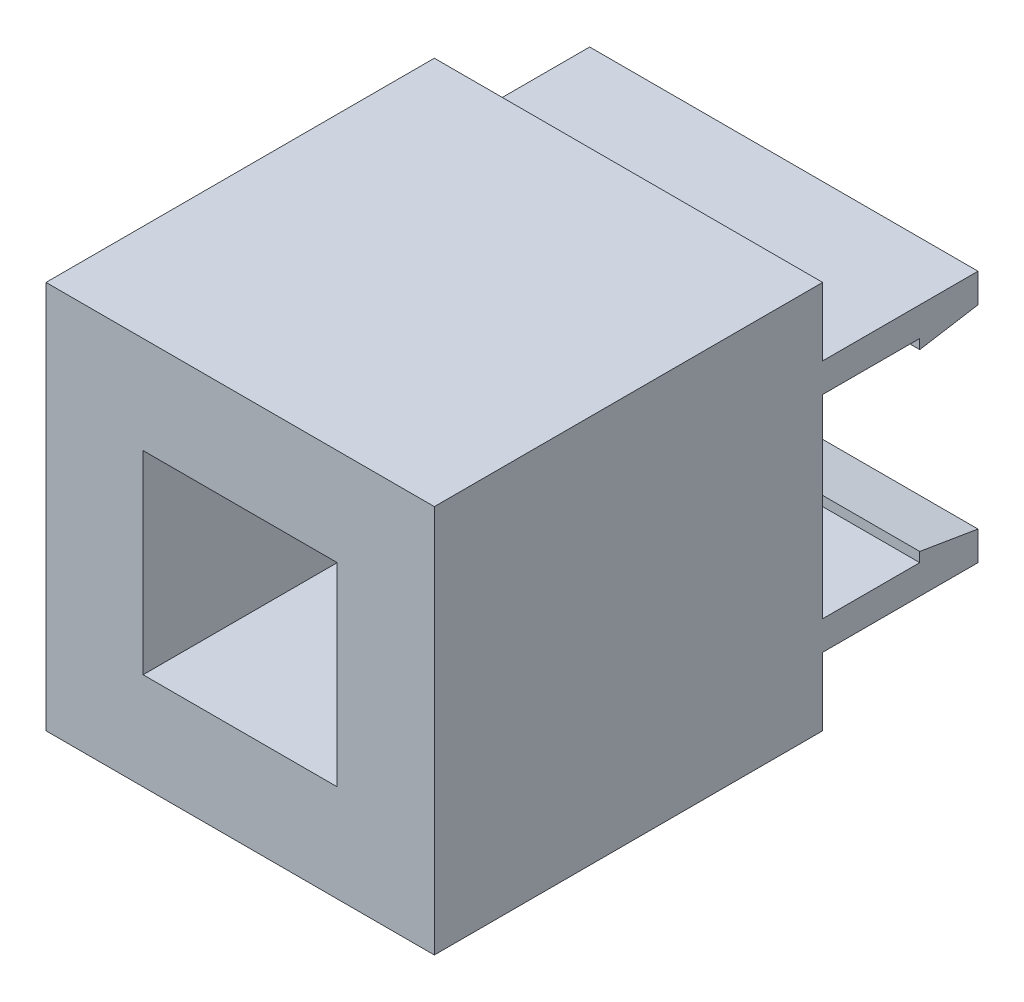
ISO-10303-21;
HEADER;
FILE_DESCRIPTION(('STEP AP214'),'2;1');
FILE_NAME('part.step','',(''),(''),'','','');
FILE_SCHEMA(('AUTOMOTIVE_DESIGN { 1 0 10303 214 1 1 1 1 }'));
ENDSEC;
DATA;
#1=APPLICATION_CONTEXT('core data for automotive mechanical design processes');
#2=APPLICATION_PROTOCOL_DEFINITION('international standard','automotive_design',2000,#1);
#3=PRODUCT_CONTEXT('',#1,'mechanical');
#4=PRODUCT('Part','Part','',(#3));
#5=PRODUCT_RELATED_PRODUCT_CATEGORY('part','',(#4));
#6=PRODUCT_DEFINITION_FORMATION('','',#4);
#7=PRODUCT_DEFINITION_CONTEXT('part definition',#1,'design');
#8=PRODUCT_DEFINITION('design','',#6,#7);
#9=PRODUCT_DEFINITION_SHAPE('','',#8);
#10=(LENGTH_UNIT() NAMED_UNIT(*) SI_UNIT(.MILLI.,.METRE.));
#11=(NAMED_UNIT(*) PLANE_ANGLE_UNIT() SI_UNIT($,.RADIAN.));
#12=(NAMED_UNIT(*) SI_UNIT($,.STERADIAN.) SOLID_ANGLE_UNIT());
#13=UNCERTAINTY_MEASURE_WITH_UNIT(LENGTH_MEASURE(1.E-05),#10,'distance_accuracy_value','');
#14=(GEOMETRIC_REPRESENTATION_CONTEXT(3) GLOBAL_UNCERTAINTY_ASSIGNED_CONTEXT((#13)) GLOBAL_UNIT_ASSIGNED_CONTEXT((#10,
#11,#12)) REPRESENTATION_CONTEXT('',''));
#15=CARTESIAN_POINT('',(0.,0.,0.));
#16=DIRECTION('',(0.,0.,1.));
#17=DIRECTION('',(1.,0.,0.));
#18=AXIS2_PLACEMENT_3D('',#15,#16,#17);
#19=CARTESIAN_POINT('',(0.,0.,0.));
#20=DIRECTION('',(0.,0.,-1.));
#21=DIRECTION('',(-1.,0.,0.));
#22=AXIS2_PLACEMENT_3D('',#19,#20,#21);
#23=PLANE('',#22);
#24=DIRECTION('',(0.,1.,0.));
#25=VECTOR('',#24,1.);
#26=CARTESIAN_POINT('',(15.,-5.,0.));
#27=LINE('',#26,#25);
#28=CARTESIAN_POINT('',(15.,0.,0.));
#29=VERTEX_POINT('',#28);
#30=CARTESIAN_POINT('',(15.,10.,0.));
#31=VERTEX_POINT('',#30);
#32=EDGE_CURVE('E189',#29,#31,#27,.T.);
#33=ORIENTED_EDGE('',*,*,#32,.F.);
#34=DIRECTION('',(1.,0.,0.));
#35=VECTOR('',#34,1.);
#36=CARTESIAN_POINT('',(-5.,0.,0.));
#37=LINE('',#36,#35);
#38=CARTESIAN_POINT('',(10.,0.,0.));
#39=VERTEX_POINT('',#38);
#40=EDGE_CURVE('E250',#39,#29,#37,.T.);
#41=ORIENTED_EDGE('',*,*,#40,.F.);
#42=DIRECTION('',(0.,1.,0.));
#43=VECTOR('',#42,1.);
#44=CARTESIAN_POINT('',(10.,0.,0.));
#45=LINE('',#44,#43);
#46=CARTESIAN_POINT('',(10.,10.,0.));
#47=VERTEX_POINT('',#46);
#48=EDGE_CURVE('E279',#39,#47,#45,.T.);
#49=ORIENTED_EDGE('',*,*,#48,.T.);
#50=DIRECTION('',(-1.,0.,0.));
#51=VECTOR('',#50,1.);
#52=CARTESIAN_POINT('',(-5.,10.,0.));
#53=LINE('',#52,#51);
#54=EDGE_CURVE('E44',#31,#47,#53,.T.);
#55=ORIENTED_EDGE('',*,*,#54,.F.);
#56=EDGE_LOOP('',(#33,#41,#49,#55));
#57=FACE_BOUND('',#56,.T.);
#58=ADVANCED_FACE('F34',(#57),#23,.T.);
#59=DIRECTION('',(0.,-1.,0.));
#60=VECTOR('',#59,1.);
#61=CARTESIAN_POINT('',(0.,0.,0.));
#62=LINE('',#61,#60);
#63=CARTESIAN_POINT('',(0.,10.,0.));
#64=VERTEX_POINT('',#63);
#65=CARTESIAN_POINT('',(0.,0.,0.));
#66=VERTEX_POINT('',#65);
#67=EDGE_CURVE('E275',#64,#66,#62,.T.);
#68=ORIENTED_EDGE('',*,*,#67,.T.);
#69=CARTESIAN_POINT('',(-5.,0.,0.));
#70=VERTEX_POINT('',#69);
#71=EDGE_CURVE('E257',#70,#66,#37,.T.);
#72=ORIENTED_EDGE('',*,*,#71,.F.);
#73=DIRECTION('',(0.,-1.,0.));
#74=VECTOR('',#73,1.);
#75=CARTESIAN_POINT('',(-5.,-5.,0.));
#76=LINE('',#75,#74);
#77=CARTESIAN_POINT('',(-5.,10.,0.));
#78=VERTEX_POINT('',#77);
#79=EDGE_CURVE('E313',#78,#70,#76,.T.);
#80=ORIENTED_EDGE('',*,*,#79,.F.);
#81=EDGE_CURVE('E11',#64,#78,#53,.T.);
#82=ORIENTED_EDGE('',*,*,#81,.F.);
#83=EDGE_LOOP('',(#68,#72,#80,#82));
#84=FACE_BOUND('',#83,.T.);
#85=ADVANCED_FACE('F391',(#84),#23,.T.);
#86=CARTESIAN_POINT('',(-5.,-1.5,0.));
#87=VERTEX_POINT('',#86);
#88=CARTESIAN_POINT('',(-5.,-5.,0.));
#89=VERTEX_POINT('',#88);
#90=EDGE_CURVE('E194',#87,#89,#76,.T.);
#91=ORIENTED_EDGE('',*,*,#90,.F.);
#92=DIRECTION('',(-1.,0.,0.));
#93=VECTOR('',#92,1.);
#94=CARTESIAN_POINT('',(15.,-1.5,0.));
#95=LINE('',#94,#93);
#96=CARTESIAN_POINT('',(15.,-1.5,0.));
#97=VERTEX_POINT('',#96);
#98=EDGE_CURVE('E192',#97,#87,#95,.T.);
#99=ORIENTED_EDGE('',*,*,#98,.F.);
#100=CARTESIAN_POINT('',(15.,-5.,0.));
#101=VERTEX_POINT('',#100);
#102=EDGE_CURVE('E176',#101,#97,#27,.T.);
#103=ORIENTED_EDGE('',*,*,#102,.F.);
#104=DIRECTION('',(1.,0.,0.));
#105=VECTOR('',#104,1.);
#106=CARTESIAN_POINT('',(-5.,-5.,0.));
#107=LINE('',#106,#105);
#108=EDGE_CURVE('E312',#89,#101,#107,.T.);
#109=ORIENTED_EDGE('',*,*,#108,.F.);
#110=EDGE_LOOP('',(#91,#99,#103,#109));
#111=FACE_BOUND('',#110,.T.);
#112=ADVANCED_FACE('F193',(#111),#23,.T.);
#113=CARTESIAN_POINT('',(0.,0.,20.));
#114=DIRECTION('',(0.,0.,-1.));
#115=DIRECTION('',(-1.,0.,0.));
#116=AXIS2_PLACEMENT_3D('',#113,#114,#115);
#117=PLANE('',#116);
#118=DIRECTION('',(0.,-1.,0.));
#119=VECTOR('',#118,1.);
#120=CARTESIAN_POINT('',(-5.,-5.,20.));
#121=LINE('',#120,#119);
#122=CARTESIAN_POINT('',(-5.,15.,20.));
#123=VERTEX_POINT('',#122);
#124=CARTESIAN_POINT('',(-5.,-5.,20.));
#125=VERTEX_POINT('',#124);
#126=EDGE_CURVE('E300',#123,#125,#121,.T.);
#127=ORIENTED_EDGE('',*,*,#126,.T.);
#128=DIRECTION('',(1.,0.,0.));
#129=VECTOR('',#128,1.);
#130=CARTESIAN_POINT('',(-5.,-5.,20.));
#131=LINE('',#130,#129);
#132=CARTESIAN_POINT('',(15.,-5.,20.));
#133=VERTEX_POINT('',#132);
#134=EDGE_CURVE('E303',#125,#133,#131,.T.);
#135=ORIENTED_EDGE('',*,*,#134,.T.);
#136=DIRECTION('',(0.,1.,0.));
#137=VECTOR('',#136,1.);
#138=CARTESIAN_POINT('',(15.,-5.,20.));
#139=LINE('',#138,#137);
#140=CARTESIAN_POINT('',(15.,15.,20.));
#141=VERTEX_POINT('',#140);
#142=EDGE_CURVE('E305',#133,#141,#139,.T.);
#143=ORIENTED_EDGE('',*,*,#142,.T.);
#144=DIRECTION('',(-1.,0.,0.));
#145=VECTOR('',#144,1.);
#146=CARTESIAN_POINT('',(-5.,15.,20.));
#147=LINE('',#146,#145);
#148=EDGE_CURVE('E307',#141,#123,#147,.T.);
#149=ORIENTED_EDGE('',*,*,#148,.T.);
#150=EDGE_LOOP('',(#127,#135,#143,#149));
#151=FACE_BOUND('',#150,.T.);
#152=DIRECTION('',(0.,-1.,0.));
#153=VECTOR('',#152,1.);
#154=CARTESIAN_POINT('',(0.,0.,20.));
#155=LINE('',#154,#153);
#156=CARTESIAN_POINT('',(0.,10.,20.));
#157=VERTEX_POINT('',#156);
#158=CARTESIAN_POINT('',(0.,0.,20.));
#159=VERTEX_POINT('',#158);
#160=EDGE_CURVE('E276',#157,#159,#155,.T.);
#161=ORIENTED_EDGE('',*,*,#160,.F.);
#162=DIRECTION('',(-1.,0.,0.));
#163=VECTOR('',#162,1.);
#164=CARTESIAN_POINT('',(0.,10.,20.));
#165=LINE('',#164,#163);
#166=CARTESIAN_POINT('',(10.,10.,20.));
#167=VERTEX_POINT('',#166);
#168=EDGE_CURVE('E284',#167,#157,#165,.T.);
#169=ORIENTED_EDGE('',*,*,#168,.F.);
#170=DIRECTION('',(0.,1.,0.));
#171=VECTOR('',#170,1.);
#172=CARTESIAN_POINT('',(10.,0.,20.));
#173=LINE('',#172,#171);
#174=CARTESIAN_POINT('',(10.,0.,20.));
#175=VERTEX_POINT('',#174);
#176=EDGE_CURVE('E281',#175,#167,#173,.T.);
#177=ORIENTED_EDGE('',*,*,#176,.F.);
#178=DIRECTION('',(1.,0.,0.));
#179=VECTOR('',#178,1.);
#180=CARTESIAN_POINT('',(0.,0.,20.));
#181=LINE('',#180,#179);
#182=EDGE_CURVE('E278',#159,#175,#181,.T.);
#183=ORIENTED_EDGE('',*,*,#182,.F.);
#184=EDGE_LOOP('',(#161,#169,#177,#183));
#185=FACE_BOUND('',#184,.T.);
#186=ADVANCED_FACE('F376',(#151,#185),#117,.F.);
#187=CARTESIAN_POINT('',(15.,11.5,0.));
#188=VERTEX_POINT('',#187);
#189=CARTESIAN_POINT('',(15.,15.,0.));
#190=VERTEX_POINT('',#189);
#191=EDGE_CURVE('E191',#188,#190,#27,.T.);
#192=ORIENTED_EDGE('',*,*,#191,.F.);
#193=DIRECTION('',(-1.,0.,0.));
#194=VECTOR('',#193,1.);
#195=CARTESIAN_POINT('',(15.,11.5,0.));
#196=LINE('',#195,#194);
#197=CARTESIAN_POINT('',(-5.,11.5,0.));
#198=VERTEX_POINT('',#197);
#199=EDGE_CURVE('E207',#188,#198,#196,.T.);
#200=ORIENTED_EDGE('',*,*,#199,.T.);
#201=CARTESIAN_POINT('',(-5.,15.,0.));
#202=VERTEX_POINT('',#201);
#203=EDGE_CURVE('E310',#202,#198,#76,.T.);
#204=ORIENTED_EDGE('',*,*,#203,.F.);
#205=DIRECTION('',(-1.,0.,0.));
#206=VECTOR('',#205,1.);
#207=CARTESIAN_POINT('',(-5.,15.,0.));
#208=LINE('',#207,#206);
#209=EDGE_CURVE('E188',#190,#202,#208,.T.);
#210=ORIENTED_EDGE('',*,*,#209,.F.);
#211=EDGE_LOOP('',(#192,#200,#204,#210));
#212=FACE_BOUND('',#211,.T.);
#213=ADVANCED_FACE('F370',(#212),#23,.T.);
#214=CARTESIAN_POINT('',(-5.,-5.,20.));
#215=DIRECTION('',(1.,0.,0.));
#216=DIRECTION('',(0.,0.,-1.));
#217=AXIS2_PLACEMENT_3D('',#214,#215,#216);
#218=PLANE('',#217);
#219=DIRECTION('',(0.,-1.,0.));
#220=VECTOR('',#219,1.);
#221=CARTESIAN_POINT('',(-5.,-3.,-8.));
#222=LINE('',#221,#220);
#223=CARTESIAN_POINT('',(-5.,0.,-8.));
#224=VERTEX_POINT('',#223);
#225=CARTESIAN_POINT('',(-5.,-1.5,-8.));
#226=VERTEX_POINT('',#225);
#227=EDGE_CURVE('E215',#224,#226,#222,.T.);
#228=ORIENTED_EDGE('',*,*,#227,.T.);
#229=DIRECTION('',(0.,0.,-1.));
#230=VECTOR('',#229,1.);
#231=CARTESIAN_POINT('',(-5.,-1.5,-8.));
#232=LINE('',#231,#230);
#233=EDGE_CURVE('E51',#87,#226,#232,.T.);
#234=ORIENTED_EDGE('',*,*,#233,.F.);
#235=ORIENTED_EDGE('',*,*,#90,.T.);
#236=DIRECTION('',(0.,0.,-1.));
#237=VECTOR('',#236,1.);
#238=CARTESIAN_POINT('',(-5.,-5.,20.));
#239=LINE('',#238,#237);
#240=EDGE_CURVE('E38',#125,#89,#239,.T.);
#241=ORIENTED_EDGE('',*,*,#240,.F.);
#242=ORIENTED_EDGE('',*,*,#126,.F.);
#243=DIRECTION('',(0.,0.,-1.));
#244=VECTOR('',#243,1.);
#245=CARTESIAN_POINT('',(-5.,15.,20.));
#246=LINE('',#245,#244);
#247=EDGE_CURVE('E309',#123,#202,#246,.T.);
#248=ORIENTED_EDGE('',*,*,#247,.T.);
#249=ORIENTED_EDGE('',*,*,#203,.T.);
#250=DIRECTION('',(0.,0.,1.));
#251=VECTOR('',#250,1.);
#252=CARTESIAN_POINT('',(-5.,11.5,-8.));
#253=LINE('',#252,#251);
#254=CARTESIAN_POINT('',(-5.,11.5,-8.));
#255=VERTEX_POINT('',#254);
#256=EDGE_CURVE('E201',#255,#198,#253,.T.);
#257=ORIENTED_EDGE('',*,*,#256,.F.);
#258=DIRECTION('',(0.,-1.,0.));
#259=VECTOR('',#258,1.);
#260=CARTESIAN_POINT('',(-5.,13.,-8.));
#261=LINE('',#260,#259);
#262=CARTESIAN_POINT('',(-5.,10.,-8.));
#263=VERTEX_POINT('',#262);
#264=EDGE_CURVE('E229',#255,#263,#261,.T.);
#265=ORIENTED_EDGE('',*,*,#264,.T.);
#266=DIRECTION('',(0.,-0.164398987305357,0.986393923832144));
#267=VECTOR('',#266,1.);
#268=CARTESIAN_POINT('',(-5.,10.,-8.));
#269=LINE('',#268,#267);
#270=CARTESIAN_POINT('',(-5.,9.5,-5.));
#271=VERTEX_POINT('',#270);
#272=EDGE_CURVE('E243',#263,#271,#269,.T.);
#273=ORIENTED_EDGE('',*,*,#272,.T.);
#274=DIRECTION('',(0.,1.,0.));
#275=VECTOR('',#274,1.);
#276=CARTESIAN_POINT('',(-5.,10.,-5.));
#277=LINE('',#276,#275);
#278=CARTESIAN_POINT('',(-5.,10.,-5.));
#279=VERTEX_POINT('',#278);
#280=EDGE_CURVE('E236',#271,#279,#277,.T.);
#281=ORIENTED_EDGE('',*,*,#280,.T.);
#282=DIRECTION('',(0.,0.,1.));
#283=VECTOR('',#282,1.);
#284=CARTESIAN_POINT('',(-5.,10.,-5.));
#285=LINE('',#284,#283);
#286=EDGE_CURVE('E267',#279,#78,#285,.T.);
#287=ORIENTED_EDGE('',*,*,#286,.T.);
#288=ORIENTED_EDGE('',*,*,#79,.T.);
#289=DIRECTION('',(0.,0.,1.));
#290=VECTOR('',#289,1.);
#291=CARTESIAN_POINT('',(-5.,0.,-5.));
#292=LINE('',#291,#290);
#293=CARTESIAN_POINT('',(-5.,0.,-5.));
#294=VERTEX_POINT('',#293);
#295=EDGE_CURVE('E262',#294,#70,#292,.T.);
#296=ORIENTED_EDGE('',*,*,#295,.F.);
#297=DIRECTION('',(0.,1.,0.));
#298=VECTOR('',#297,1.);
#299=CARTESIAN_POINT('',(-5.,0.,-5.));
#300=LINE('',#299,#298);
#301=CARTESIAN_POINT('',(-5.,0.5,-5.));
#302=VERTEX_POINT('',#301);
#303=EDGE_CURVE('E210',#294,#302,#300,.T.);
#304=ORIENTED_EDGE('',*,*,#303,.T.);
#305=DIRECTION('',(0.,-0.164398987305357,-0.986393923832144));
#306=VECTOR('',#305,1.);
#307=CARTESIAN_POINT('',(-5.,0.,-8.));
#308=LINE('',#307,#306);
#309=EDGE_CURVE('E222',#302,#224,#308,.T.);
#310=ORIENTED_EDGE('',*,*,#309,.T.);
#311=EDGE_LOOP('',(#228,#234,#235,#241,#242,#248,#249,#257,#265,#273,#281,#287,#288,#296,#304,#310));
#312=FACE_BOUND('',#311,.T.);
#313=ADVANCED_FACE('F36',(#312),#218,.F.);
#314=CARTESIAN_POINT('',(-5.,-5.,20.));
#315=DIRECTION('',(0.,1.,0.));
#316=DIRECTION('',(0.,0.,1.));
#317=AXIS2_PLACEMENT_3D('',#314,#315,#316);
#318=PLANE('',#317);
#319=ORIENTED_EDGE('',*,*,#108,.T.);
#320=DIRECTION('',(0.,0.,-1.));
#321=VECTOR('',#320,1.);
#322=CARTESIAN_POINT('',(15.,-5.,20.));
#323=LINE('',#322,#321);
#324=EDGE_CURVE('E185',#133,#101,#323,.T.);
#325=ORIENTED_EDGE('',*,*,#324,.F.);
#326=ORIENTED_EDGE('',*,*,#134,.F.);
#327=ORIENTED_EDGE('',*,*,#240,.T.);
#328=EDGE_LOOP('',(#319,#325,#326,#327));
#329=FACE_BOUND('',#328,.T.);
#330=ADVANCED_FACE('F323',(#329),#318,.F.);
#331=CARTESIAN_POINT('',(15.,-5.,20.));
#332=DIRECTION('',(-1.,0.,0.));
#333=DIRECTION('',(0.,0.,1.));
#334=AXIS2_PLACEMENT_3D('',#331,#332,#333);
#335=PLANE('',#334);
#336=ORIENTED_EDGE('',*,*,#102,.T.);
#337=DIRECTION('',(0.,0.,-1.));
#338=VECTOR('',#337,1.);
#339=CARTESIAN_POINT('',(15.,-1.5,-8.));
#340=LINE('',#339,#338);
#341=CARTESIAN_POINT('',(15.,-1.5,-8.));
#342=VERTEX_POINT('',#341);
#343=EDGE_CURVE('E181',#97,#342,#340,.T.);
#344=ORIENTED_EDGE('',*,*,#343,.T.);
#345=DIRECTION('',(0.,-1.,0.));
#346=VECTOR('',#345,1.);
#347=CARTESIAN_POINT('',(15.,-3.,-8.));
#348=LINE('',#347,#346);
#349=CARTESIAN_POINT('',(15.,0.,-8.));
#350=VERTEX_POINT('',#349);
#351=EDGE_CURVE('E218',#350,#342,#348,.T.);
#352=ORIENTED_EDGE('',*,*,#351,.F.);
#353=DIRECTION('',(0.,-0.164398987305357,-0.986393923832144));
#354=VECTOR('',#353,1.);
#355=CARTESIAN_POINT('',(15.,0.,-8.));
#356=LINE('',#355,#354);
#357=CARTESIAN_POINT('',(15.,0.5,-5.));
#358=VERTEX_POINT('',#357);
#359=EDGE_CURVE('E214',#358,#350,#356,.T.);
#360=ORIENTED_EDGE('',*,*,#359,.F.);
#361=DIRECTION('',(0.,1.,0.));
#362=VECTOR('',#361,1.);
#363=CARTESIAN_POINT('',(15.,-3.,-5.));
#364=LINE('',#363,#362);
#365=CARTESIAN_POINT('',(15.,0.,-5.));
#366=VERTEX_POINT('',#365);
#367=EDGE_CURVE('E212',#366,#358,#364,.T.);
#368=ORIENTED_EDGE('',*,*,#367,.F.);
#369=DIRECTION('',(0.,0.,1.));
#370=VECTOR('',#369,1.);
#371=CARTESIAN_POINT('',(15.,0.,-5.));
#372=LINE('',#371,#370);
#373=EDGE_CURVE('E256',#366,#29,#372,.T.);
#374=ORIENTED_EDGE('',*,*,#373,.T.);
#375=ORIENTED_EDGE('',*,*,#32,.T.);
#376=DIRECTION('',(0.,0.,1.));
#377=VECTOR('',#376,1.);
#378=CARTESIAN_POINT('',(15.,10.,-5.));
#379=LINE('',#378,#377);
#380=CARTESIAN_POINT('',(15.,10.,-5.));
#381=VERTEX_POINT('',#380);
#382=EDGE_CURVE('E272',#381,#31,#379,.T.);
#383=ORIENTED_EDGE('',*,*,#382,.F.);
#384=DIRECTION('',(0.,1.,0.));
#385=VECTOR('',#384,1.);
#386=CARTESIAN_POINT('',(15.,10.,-5.));
#387=LINE('',#386,#385);
#388=CARTESIAN_POINT('',(15.,9.5,-5.));
#389=VERTEX_POINT('',#388);
#390=EDGE_CURVE('E232',#389,#381,#387,.T.);
#391=ORIENTED_EDGE('',*,*,#390,.F.);
#392=DIRECTION('',(0.,-0.164398987305357,0.986393923832144));
#393=VECTOR('',#392,1.);
#394=CARTESIAN_POINT('',(15.,10.,-8.));
#395=LINE('',#394,#393);
#396=CARTESIAN_POINT('',(15.,10.,-8.));
#397=VERTEX_POINT('',#396);
#398=EDGE_CURVE('E238',#397,#389,#395,.T.);
#399=ORIENTED_EDGE('',*,*,#398,.F.);
#400=DIRECTION('',(0.,-1.,0.));
#401=VECTOR('',#400,1.);
#402=CARTESIAN_POINT('',(15.,13.,-8.));
#403=LINE('',#402,#401);
#404=CARTESIAN_POINT('',(15.,11.5,-8.));
#405=VERTEX_POINT('',#404);
#406=EDGE_CURVE('E235',#405,#397,#403,.T.);
#407=ORIENTED_EDGE('',*,*,#406,.F.);
#408=DIRECTION('',(0.,0.,1.));
#409=VECTOR('',#408,1.);
#410=CARTESIAN_POINT('',(15.,11.5,-8.));
#411=LINE('',#410,#409);
#412=EDGE_CURVE('E59',#405,#188,#411,.T.);
#413=ORIENTED_EDGE('',*,*,#412,.T.);
#414=ORIENTED_EDGE('',*,*,#191,.T.);
#415=DIRECTION('',(0.,0.,-1.));
#416=VECTOR('',#415,1.);
#417=CARTESIAN_POINT('',(15.,15.,20.));
#418=LINE('',#417,#416);
#419=EDGE_CURVE('E318',#141,#190,#418,.T.);
#420=ORIENTED_EDGE('',*,*,#419,.F.);
#421=ORIENTED_EDGE('',*,*,#142,.F.);
#422=ORIENTED_EDGE('',*,*,#324,.T.);
#423=EDGE_LOOP('',(#336,#344,#352,#360,#368,#374,#375,#383,#391,#399,#407,#413,#414,#420,#421,#422));
#424=FACE_BOUND('',#423,.T.);
#425=ADVANCED_FACE('F178',(#424),#335,.F.);
#426=CARTESIAN_POINT('',(-5.,15.,20.));
#427=DIRECTION('',(0.,-1.,0.));
#428=DIRECTION('',(0.,0.,-1.));
#429=AXIS2_PLACEMENT_3D('',#426,#427,#428);
#430=PLANE('',#429);
#431=ORIENTED_EDGE('',*,*,#209,.T.);
#432=ORIENTED_EDGE('',*,*,#247,.F.);
#433=ORIENTED_EDGE('',*,*,#148,.F.);
#434=ORIENTED_EDGE('',*,*,#419,.T.);
#435=EDGE_LOOP('',(#431,#432,#433,#434));
#436=FACE_BOUND('',#435,.T.);
#437=ADVANCED_FACE('F374',(#436),#430,.F.);
#438=CARTESIAN_POINT('',(0.,0.,20.));
#439=DIRECTION('',(1.,0.,0.));
#440=DIRECTION('',(0.,0.,-1.));
#441=AXIS2_PLACEMENT_3D('',#438,#439,#440);
#442=PLANE('',#441);
#443=ORIENTED_EDGE('',*,*,#67,.F.);
#444=DIRECTION('',(0.,0.,-1.));
#445=VECTOR('',#444,1.);
#446=CARTESIAN_POINT('',(0.,10.,20.));
#447=LINE('',#446,#445);
#448=EDGE_CURVE('E286',#157,#64,#447,.T.);
#449=ORIENTED_EDGE('',*,*,#448,.F.);
#450=ORIENTED_EDGE('',*,*,#160,.T.);
#451=DIRECTION('',(0.,0.,-1.));
#452=VECTOR('',#451,1.);
#453=CARTESIAN_POINT('',(0.,0.,20.));
#454=LINE('',#453,#452);
#455=EDGE_CURVE('E298',#159,#66,#454,.T.);
#456=ORIENTED_EDGE('',*,*,#455,.T.);
#457=EDGE_LOOP('',(#443,#449,#450,#456));
#458=FACE_BOUND('',#457,.T.);
#459=ADVANCED_FACE('F387',(#458),#442,.T.);
#460=CARTESIAN_POINT('',(0.,0.,20.));
#461=DIRECTION('',(0.,1.,0.));
#462=DIRECTION('',(0.,0.,1.));
#463=AXIS2_PLACEMENT_3D('',#460,#461,#462);
#464=PLANE('',#463);
#465=DIRECTION('',(0.,0.,-1.));
#466=VECTOR('',#465,1.);
#467=CARTESIAN_POINT('',(10.,0.,20.));
#468=LINE('',#467,#466);
#469=EDGE_CURVE('E295',#175,#39,#468,.T.);
#470=ORIENTED_EDGE('',*,*,#469,.T.);
#471=ORIENTED_EDGE('',*,*,#40,.T.);
#472=ORIENTED_EDGE('',*,*,#373,.F.);
#473=DIRECTION('',(1.,0.,0.));
#474=VECTOR('',#473,1.);
#475=CARTESIAN_POINT('',(-5.,0.,-5.));
#476=LINE('',#475,#474);
#477=EDGE_CURVE('E253',#294,#366,#476,.T.);
#478=ORIENTED_EDGE('',*,*,#477,.F.);
#479=ORIENTED_EDGE('',*,*,#295,.T.);
#480=ORIENTED_EDGE('',*,*,#71,.T.);
#481=ORIENTED_EDGE('',*,*,#455,.F.);
#482=ORIENTED_EDGE('',*,*,#182,.T.);
#483=EDGE_LOOP('',(#470,#471,#472,#478,#479,#480,#481,#482));
#484=FACE_BOUND('',#483,.T.);
#485=ADVANCED_FACE('F330',(#484),#464,.T.);
#486=CARTESIAN_POINT('',(10.,0.,20.));
#487=DIRECTION('',(-1.,0.,0.));
#488=DIRECTION('',(0.,0.,1.));
#489=AXIS2_PLACEMENT_3D('',#486,#487,#488);
#490=PLANE('',#489);
#491=ORIENTED_EDGE('',*,*,#48,.F.);
#492=ORIENTED_EDGE('',*,*,#469,.F.);
#493=ORIENTED_EDGE('',*,*,#176,.T.);
#494=DIRECTION('',(0.,0.,-1.));
#495=VECTOR('',#494,1.);
#496=CARTESIAN_POINT('',(10.,10.,20.));
#497=LINE('',#496,#495);
#498=EDGE_CURVE('E293',#167,#47,#497,.T.);
#499=ORIENTED_EDGE('',*,*,#498,.T.);
#500=EDGE_LOOP('',(#491,#492,#493,#499));
#501=FACE_BOUND('',#500,.T.);
#502=ADVANCED_FACE('F390',(#501),#490,.T.);
#503=CARTESIAN_POINT('',(0.,10.,20.));
#504=DIRECTION('',(0.,-1.,0.));
#505=DIRECTION('',(0.,0.,-1.));
#506=AXIS2_PLACEMENT_3D('',#503,#504,#505);
#507=PLANE('',#506);
#508=ORIENTED_EDGE('',*,*,#448,.T.);
#509=ORIENTED_EDGE('',*,*,#81,.T.);
#510=ORIENTED_EDGE('',*,*,#286,.F.);
#511=DIRECTION('',(-1.,0.,0.));
#512=VECTOR('',#511,1.);
#513=CARTESIAN_POINT('',(-5.,10.,-5.));
#514=LINE('',#513,#512);
#515=EDGE_CURVE('E265',#381,#279,#514,.T.);
#516=ORIENTED_EDGE('',*,*,#515,.F.);
#517=ORIENTED_EDGE('',*,*,#382,.T.);
#518=ORIENTED_EDGE('',*,*,#54,.T.);
#519=ORIENTED_EDGE('',*,*,#498,.F.);
#520=ORIENTED_EDGE('',*,*,#168,.T.);
#521=EDGE_LOOP('',(#508,#509,#510,#516,#517,#518,#519,#520));
#522=FACE_BOUND('',#521,.T.);
#523=ADVANCED_FACE('F350',(#522),#507,.T.);
#524=CARTESIAN_POINT('',(15.,10.,-5.));
#525=DIRECTION('',(0.,0.,1.));
#526=DIRECTION('',(0.,-1.,0.));
#527=AXIS2_PLACEMENT_3D('',#524,#525,#526);
#528=PLANE('',#527);
#529=ORIENTED_EDGE('',*,*,#390,.T.);
#530=ORIENTED_EDGE('',*,*,#515,.T.);
#531=ORIENTED_EDGE('',*,*,#280,.F.);
#532=DIRECTION('',(-1.,0.,0.));
#533=VECTOR('',#532,1.);
#534=CARTESIAN_POINT('',(15.,9.5,-5.));
#535=LINE('',#534,#533);
#536=EDGE_CURVE('E248',#389,#271,#535,.T.);
#537=ORIENTED_EDGE('',*,*,#536,.F.);
#538=EDGE_LOOP('',(#529,#530,#531,#537));
#539=FACE_BOUND('',#538,.T.);
#540=ADVANCED_FACE('F354',(#539),#528,.T.);
#541=CARTESIAN_POINT('',(15.,10.,-8.));
#542=DIRECTION('',(0.,-0.986393923832144,-0.164398987305357));
#543=DIRECTION('',(0.,0.164398987305357,-0.986393923832144));
#544=AXIS2_PLACEMENT_3D('',#541,#542,#543);
#545=PLANE('',#544);
#546=ORIENTED_EDGE('',*,*,#272,.F.);
#547=DIRECTION('',(-1.,0.,0.));
#548=VECTOR('',#547,1.);
#549=CARTESIAN_POINT('',(15.,10.,-8.));
#550=LINE('',#549,#548);
#551=EDGE_CURVE('E241',#397,#263,#550,.T.);
#552=ORIENTED_EDGE('',*,*,#551,.F.);
#553=ORIENTED_EDGE('',*,*,#398,.T.);
#554=ORIENTED_EDGE('',*,*,#536,.T.);
#555=EDGE_LOOP('',(#546,#552,#553,#554));
#556=FACE_BOUND('',#555,.T.);
#557=ADVANCED_FACE('F360',(#556),#545,.T.);
#558=CARTESIAN_POINT('',(15.,13.,-8.));
#559=DIRECTION('',(0.,0.,-1.));
#560=DIRECTION('',(-1.,0.,0.));
#561=AXIS2_PLACEMENT_3D('',#558,#559,#560);
#562=PLANE('',#561);
#563=DIRECTION('',(-1.,0.,0.));
#564=VECTOR('',#563,1.);
#565=CARTESIAN_POINT('',(15.,11.5,-8.));
#566=LINE('',#565,#564);
#567=EDGE_CURVE('E204',#405,#255,#566,.T.);
#568=ORIENTED_EDGE('',*,*,#567,.F.);
#569=ORIENTED_EDGE('',*,*,#406,.T.);
#570=ORIENTED_EDGE('',*,*,#551,.T.);
#571=ORIENTED_EDGE('',*,*,#264,.F.);
#572=EDGE_LOOP('',(#568,#569,#570,#571));
#573=FACE_BOUND('',#572,.T.);
#574=ADVANCED_FACE('F363',(#573),#562,.T.);
#575=CARTESIAN_POINT('',(15.,-3.,-8.));
#576=DIRECTION('',(0.,0.,-1.));
#577=DIRECTION('',(-1.,0.,0.));
#578=AXIS2_PLACEMENT_3D('',#575,#576,#577);
#579=PLANE('',#578);
#580=DIRECTION('',(-1.,0.,0.));
#581=VECTOR('',#580,1.);
#582=CARTESIAN_POINT('',(15.,-1.5,-8.));
#583=LINE('',#582,#581);
#584=EDGE_CURVE('E195',#342,#226,#583,.T.);
#585=ORIENTED_EDGE('',*,*,#584,.T.);
#586=ORIENTED_EDGE('',*,*,#227,.F.);
#587=DIRECTION('',(-1.,0.,0.));
#588=VECTOR('',#587,1.);
#589=CARTESIAN_POINT('',(15.,0.,-8.));
#590=LINE('',#589,#588);
#591=EDGE_CURVE('E227',#350,#224,#590,.T.);
#592=ORIENTED_EDGE('',*,*,#591,.F.);
#593=ORIENTED_EDGE('',*,*,#351,.T.);
#594=EDGE_LOOP('',(#585,#586,#592,#593));
#595=FACE_BOUND('',#594,.T.);
#596=ADVANCED_FACE('F344',(#595),#579,.T.);
#597=CARTESIAN_POINT('',(15.,0.,-8.));
#598=DIRECTION('',(0.,0.986393923832144,-0.164398987305357));
#599=DIRECTION('',(0.,0.164398987305357,0.986393923832144));
#600=AXIS2_PLACEMENT_3D('',#597,#598,#599);
#601=PLANE('',#600);
#602=ORIENTED_EDGE('',*,*,#309,.F.);
#603=DIRECTION('',(-1.,0.,0.));
#604=VECTOR('',#603,1.);
#605=CARTESIAN_POINT('',(15.,0.5,-5.));
#606=LINE('',#605,#604);
#607=EDGE_CURVE('E220',#358,#302,#606,.T.);
#608=ORIENTED_EDGE('',*,*,#607,.F.);
#609=ORIENTED_EDGE('',*,*,#359,.T.);
#610=ORIENTED_EDGE('',*,*,#591,.T.);
#611=EDGE_LOOP('',(#602,#608,#609,#610));
#612=FACE_BOUND('',#611,.T.);
#613=ADVANCED_FACE('F341',(#612),#601,.T.);
#614=CARTESIAN_POINT('',(15.,0.,-5.));
#615=DIRECTION('',(0.,0.,1.));
#616=DIRECTION('',(1.,0.,0.));
#617=AXIS2_PLACEMENT_3D('',#614,#615,#616);
#618=PLANE('',#617);
#619=ORIENTED_EDGE('',*,*,#303,.F.);
#620=ORIENTED_EDGE('',*,*,#477,.T.);
#621=ORIENTED_EDGE('',*,*,#367,.T.);
#622=ORIENTED_EDGE('',*,*,#607,.T.);
#623=EDGE_LOOP('',(#619,#620,#621,#622));
#624=FACE_BOUND('',#623,.T.);
#625=ADVANCED_FACE('F336',(#624),#618,.T.);
#626=CARTESIAN_POINT('',(15.,11.5,-8.));
#627=DIRECTION('',(0.,-1.,0.));
#628=DIRECTION('',(0.,0.,-1.));
#629=AXIS2_PLACEMENT_3D('',#626,#627,#628);
#630=PLANE('',#629);
#631=ORIENTED_EDGE('',*,*,#256,.T.);
#632=ORIENTED_EDGE('',*,*,#199,.F.);
#633=ORIENTED_EDGE('',*,*,#412,.F.);
#634=ORIENTED_EDGE('',*,*,#567,.T.);
#635=EDGE_LOOP('',(#631,#632,#633,#634));
#636=FACE_BOUND('',#635,.T.);
#637=ADVANCED_FACE('F365',(#636),#630,.F.);
#638=CARTESIAN_POINT('',(15.,-1.5,-8.));
#639=DIRECTION('',(0.,1.,0.));
#640=DIRECTION('',(0.,0.,1.));
#641=AXIS2_PLACEMENT_3D('',#638,#639,#640);
#642=PLANE('',#641);
#643=ORIENTED_EDGE('',*,*,#233,.T.);
#644=ORIENTED_EDGE('',*,*,#584,.F.);
#645=ORIENTED_EDGE('',*,*,#343,.F.);
#646=ORIENTED_EDGE('',*,*,#98,.T.);
#647=EDGE_LOOP('',(#643,#644,#645,#646));
#648=FACE_BOUND('',#647,.T.);
#649=ADVANCED_FACE('F197',(#648),#642,.F.);
#650=CLOSED_SHELL('',(#58,#85,#112,#186,#213,#313,#330,#425,#437,#459,#485,#502,#523,#540,#557,
#574,#596,#613,#625,#637,#649));
#651=MANIFOLD_SOLID_BREP('B2',#650);
#652=ADVANCED_BREP_SHAPE_REPRESENTATION('',(#18,#651),#14);
#653=SHAPE_DEFINITION_REPRESENTATION(#9,#652);
ENDSEC;
END-ISO-10303-21;
